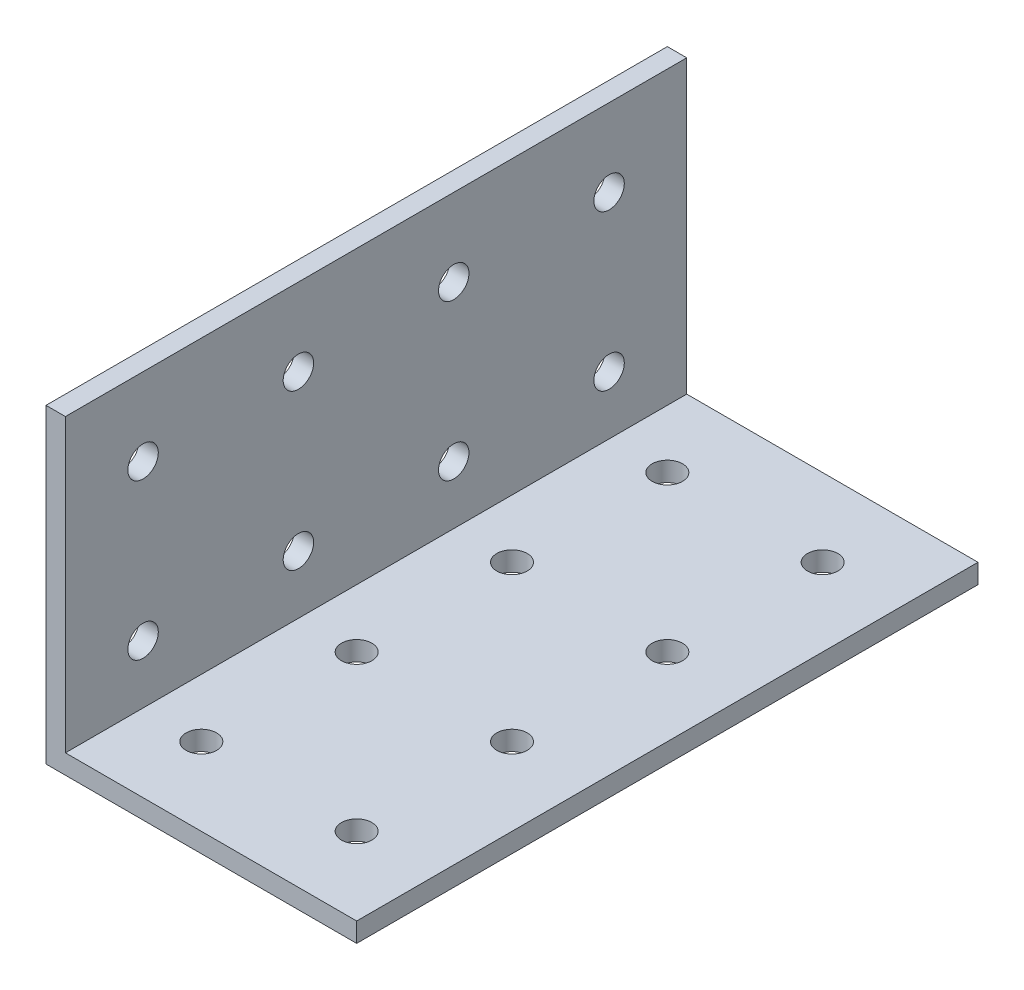
ISO-10303-21;
HEADER;
FILE_DESCRIPTION(('STEP AP214'),'2;1');
FILE_NAME('part.step','',(''),(''),'','','');
FILE_SCHEMA(('AUTOMOTIVE_DESIGN { 1 0 10303 214 1 1 1 1 }'));
ENDSEC;
DATA;
#1=APPLICATION_CONTEXT('core data for automotive mechanical design processes');
#2=APPLICATION_PROTOCOL_DEFINITION('international standard','automotive_design',2000,#1);
#3=PRODUCT_CONTEXT('',#1,'mechanical');
#4=PRODUCT('Part','Part','',(#3));
#5=PRODUCT_RELATED_PRODUCT_CATEGORY('part','',(#4));
#6=PRODUCT_DEFINITION_FORMATION('','',#4);
#7=PRODUCT_DEFINITION_CONTEXT('part definition',#1,'design');
#8=PRODUCT_DEFINITION('design','',#6,#7);
#9=PRODUCT_DEFINITION_SHAPE('','',#8);
#10=(LENGTH_UNIT() NAMED_UNIT(*) SI_UNIT(.MILLI.,.METRE.));
#11=(NAMED_UNIT(*) PLANE_ANGLE_UNIT() SI_UNIT($,.RADIAN.));
#12=(NAMED_UNIT(*) SI_UNIT($,.STERADIAN.) SOLID_ANGLE_UNIT());
#13=UNCERTAINTY_MEASURE_WITH_UNIT(LENGTH_MEASURE(1.E-05),#10,'distance_accuracy_value','');
#14=(GEOMETRIC_REPRESENTATION_CONTEXT(3) GLOBAL_UNCERTAINTY_ASSIGNED_CONTEXT((#13)) GLOBAL_UNIT_ASSIGNED_CONTEXT((#10,
#11,#12)) REPRESENTATION_CONTEXT('',''));
#15=CARTESIAN_POINT('',(0.,0.,0.));
#16=DIRECTION('',(0.,0.,1.));
#17=DIRECTION('',(1.,0.,0.));
#18=AXIS2_PLACEMENT_3D('',#15,#16,#17);
#19=CARTESIAN_POINT('',(0.,0.,101.6));
#20=DIRECTION('',(-1.,0.,0.));
#21=DIRECTION('',(0.,0.,1.));
#22=AXIS2_PLACEMENT_3D('',#19,#20,#21);
#23=PLANE('',#22);
#24=CARTESIAN_POINT('',(0.,12.7,63.5));
#25=DIRECTION('',(-1.,0.,0.));
#26=DIRECTION('',(0.,0.,1.));
#27=AXIS2_PLACEMENT_3D('',#24,#25,#26);
#28=CIRCLE('',#27,2.48920000000001);
#29=CARTESIAN_POINT('',(0.,12.7,65.9892));
#30=VERTEX_POINT('',#29);
#31=EDGE_CURVE('E193',#30,#30,#28,.T.);
#32=ORIENTED_EDGE('',*,*,#31,.F.);
#33=EDGE_LOOP('',(#32));
#34=FACE_BOUND('',#33,.T.);
#35=CARTESIAN_POINT('',(0.,38.1,12.7));
#36=DIRECTION('',(-1.,0.,0.));
#37=DIRECTION('',(0.,0.,1.));
#38=AXIS2_PLACEMENT_3D('',#35,#36,#37);
#39=CIRCLE('',#38,2.4892);
#40=CARTESIAN_POINT('',(0.,38.1,15.1892));
#41=VERTEX_POINT('',#40);
#42=EDGE_CURVE('E197',#41,#41,#39,.T.);
#43=ORIENTED_EDGE('',*,*,#42,.F.);
#44=EDGE_LOOP('',(#43));
#45=FACE_BOUND('',#44,.T.);
#46=CARTESIAN_POINT('',(0.,38.1,38.1));
#47=DIRECTION('',(-1.,0.,0.));
#48=DIRECTION('',(0.,0.,1.));
#49=AXIS2_PLACEMENT_3D('',#46,#47,#48);
#50=CIRCLE('',#49,2.4892);
#51=CARTESIAN_POINT('',(0.,38.1,40.5892));
#52=VERTEX_POINT('',#51);
#53=EDGE_CURVE('E201',#52,#52,#50,.T.);
#54=ORIENTED_EDGE('',*,*,#53,.F.);
#55=EDGE_LOOP('',(#54));
#56=FACE_BOUND('',#55,.T.);
#57=CARTESIAN_POINT('',(0.,38.1,63.5));
#58=DIRECTION('',(-1.,0.,0.));
#59=DIRECTION('',(0.,0.,1.));
#60=AXIS2_PLACEMENT_3D('',#57,#58,#59);
#61=CIRCLE('',#60,2.48920000000001);
#62=CARTESIAN_POINT('',(0.,38.1,65.9892));
#63=VERTEX_POINT('',#62);
#64=EDGE_CURVE('E205',#63,#63,#61,.T.);
#65=ORIENTED_EDGE('',*,*,#64,.F.);
#66=EDGE_LOOP('',(#65));
#67=FACE_BOUND('',#66,.T.);
#68=CARTESIAN_POINT('',(0.,12.7,38.1));
#69=DIRECTION('',(-1.,0.,0.));
#70=DIRECTION('',(0.,0.,1.));
#71=AXIS2_PLACEMENT_3D('',#68,#69,#70);
#72=CIRCLE('',#71,2.4892);
#73=CARTESIAN_POINT('',(0.,12.7,40.5892));
#74=VERTEX_POINT('',#73);
#75=EDGE_CURVE('E209',#74,#74,#72,.T.);
#76=ORIENTED_EDGE('',*,*,#75,.F.);
#77=EDGE_LOOP('',(#76));
#78=FACE_BOUND('',#77,.T.);
#79=CARTESIAN_POINT('',(0.,12.7,12.7));
#80=DIRECTION('',(-1.,0.,0.));
#81=DIRECTION('',(0.,0.,1.));
#82=AXIS2_PLACEMENT_3D('',#79,#80,#81);
#83=CIRCLE('',#82,2.4892);
#84=CARTESIAN_POINT('',(0.,12.7,15.1892));
#85=VERTEX_POINT('',#84);
#86=EDGE_CURVE('E213',#85,#85,#83,.T.);
#87=ORIENTED_EDGE('',*,*,#86,.F.);
#88=EDGE_LOOP('',(#87));
#89=FACE_BOUND('',#88,.T.);
#90=CARTESIAN_POINT('',(0.,12.7,88.9));
#91=DIRECTION('',(-1.,0.,0.));
#92=DIRECTION('',(0.,0.,1.));
#93=AXIS2_PLACEMENT_3D('',#90,#91,#92);
#94=CIRCLE('',#93,2.4892);
#95=CARTESIAN_POINT('',(0.,12.7,91.3892));
#96=VERTEX_POINT('',#95);
#97=EDGE_CURVE('E217',#96,#96,#94,.T.);
#98=ORIENTED_EDGE('',*,*,#97,.F.);
#99=EDGE_LOOP('',(#98));
#100=FACE_BOUND('',#99,.T.);
#101=CARTESIAN_POINT('',(0.,38.1,88.9));
#102=DIRECTION('',(-1.,0.,0.));
#103=DIRECTION('',(0.,0.,1.));
#104=AXIS2_PLACEMENT_3D('',#101,#102,#103);
#105=CIRCLE('',#104,2.4892);
#106=CARTESIAN_POINT('',(0.,38.1,91.3892));
#107=VERTEX_POINT('',#106);
#108=EDGE_CURVE('E220',#107,#107,#105,.T.);
#109=ORIENTED_EDGE('',*,*,#108,.F.);
#110=EDGE_LOOP('',(#109));
#111=FACE_BOUND('',#110,.T.);
#112=DIRECTION('',(0.,1.,0.));
#113=VECTOR('',#112,1.);
#114=CARTESIAN_POINT('',(0.,0.,0.));
#115=LINE('',#114,#113);
#116=CARTESIAN_POINT('',(0.,0.,0.));
#117=VERTEX_POINT('',#116);
#118=CARTESIAN_POINT('',(0.,50.8,0.));
#119=VERTEX_POINT('',#118);
#120=EDGE_CURVE('E134',#117,#119,#115,.T.);
#121=ORIENTED_EDGE('',*,*,#120,.F.);
#122=DIRECTION('',(0.,0.,-1.));
#123=VECTOR('',#122,1.);
#124=CARTESIAN_POINT('',(0.,0.,101.6));
#125=LINE('',#124,#123);
#126=CARTESIAN_POINT('',(0.,0.,101.6));
#127=VERTEX_POINT('',#126);
#128=EDGE_CURVE('E11',#127,#117,#125,.T.);
#129=ORIENTED_EDGE('',*,*,#128,.F.);
#130=DIRECTION('',(0.,1.,0.));
#131=VECTOR('',#130,1.);
#132=CARTESIAN_POINT('',(0.,0.,101.6));
#133=LINE('',#132,#131);
#134=CARTESIAN_POINT('',(0.,50.8,101.6));
#135=VERTEX_POINT('',#134);
#136=EDGE_CURVE('E154',#127,#135,#133,.T.);
#137=ORIENTED_EDGE('',*,*,#136,.T.);
#138=DIRECTION('',(0.,0.,-1.));
#139=VECTOR('',#138,1.);
#140=CARTESIAN_POINT('',(0.,50.8,101.6));
#141=LINE('',#140,#139);
#142=EDGE_CURVE('E62',#135,#119,#141,.T.);
#143=ORIENTED_EDGE('',*,*,#142,.T.);
#144=EDGE_LOOP('',(#121,#129,#137,#143));
#145=FACE_BOUND('',#144,.T.);
#146=ADVANCED_FACE('F45',(#34,#45,#56,#67,#78,#89,#100,#111,#145),#23,.T.);
#147=CARTESIAN_POINT('',(0.,0.,101.6));
#148=DIRECTION('',(0.,1.,0.));
#149=DIRECTION('',(0.,0.,1.));
#150=AXIS2_PLACEMENT_3D('',#147,#148,#149);
#151=PLANE('',#150);
#152=CARTESIAN_POINT('',(38.1,0.,88.9));
#153=DIRECTION('',(0.,1.,0.));
#154=DIRECTION('',(0.,0.,1.));
#155=AXIS2_PLACEMENT_3D('',#152,#153,#154);
#156=CIRCLE('',#155,2.4892);
#157=CARTESIAN_POINT('',(38.1,0.,91.3892));
#158=VERTEX_POINT('',#157);
#159=EDGE_CURVE('E138',#158,#158,#156,.T.);
#160=ORIENTED_EDGE('',*,*,#159,.T.);
#161=EDGE_LOOP('',(#160));
#162=FACE_BOUND('',#161,.T.);
#163=CARTESIAN_POINT('',(38.1,0.,63.5));
#164=DIRECTION('',(0.,1.,0.));
#165=DIRECTION('',(0.,0.,1.));
#166=AXIS2_PLACEMENT_3D('',#163,#164,#165);
#167=CIRCLE('',#166,2.4892);
#168=CARTESIAN_POINT('',(38.1,0.,65.9892));
#169=VERTEX_POINT('',#168);
#170=EDGE_CURVE('E301',#169,#169,#167,.T.);
#171=ORIENTED_EDGE('',*,*,#170,.T.);
#172=EDGE_LOOP('',(#171));
#173=FACE_BOUND('',#172,.T.);
#174=CARTESIAN_POINT('',(38.1,0.,38.1));
#175=DIRECTION('',(0.,1.,0.));
#176=DIRECTION('',(0.,0.,1.));
#177=AXIS2_PLACEMENT_3D('',#174,#175,#176);
#178=CIRCLE('',#177,2.4892);
#179=CARTESIAN_POINT('',(38.1,0.,40.5892));
#180=VERTEX_POINT('',#179);
#181=EDGE_CURVE('E297',#180,#180,#178,.T.);
#182=ORIENTED_EDGE('',*,*,#181,.T.);
#183=EDGE_LOOP('',(#182));
#184=FACE_BOUND('',#183,.T.);
#185=CARTESIAN_POINT('',(12.7,0.,88.9));
#186=DIRECTION('',(0.,1.,0.));
#187=DIRECTION('',(0.,0.,1.));
#188=AXIS2_PLACEMENT_3D('',#185,#186,#187);
#189=CIRCLE('',#188,2.4892);
#190=CARTESIAN_POINT('',(12.7,0.,91.3892));
#191=VERTEX_POINT('',#190);
#192=EDGE_CURVE('E293',#191,#191,#189,.T.);
#193=ORIENTED_EDGE('',*,*,#192,.T.);
#194=EDGE_LOOP('',(#193));
#195=FACE_BOUND('',#194,.T.);
#196=CARTESIAN_POINT('',(12.7,0.,63.5));
#197=DIRECTION('',(0.,1.,0.));
#198=DIRECTION('',(0.,0.,1.));
#199=AXIS2_PLACEMENT_3D('',#196,#197,#198);
#200=CIRCLE('',#199,2.4892);
#201=CARTESIAN_POINT('',(12.7,0.,65.9892));
#202=VERTEX_POINT('',#201);
#203=EDGE_CURVE('E289',#202,#202,#200,.T.);
#204=ORIENTED_EDGE('',*,*,#203,.T.);
#205=EDGE_LOOP('',(#204));
#206=FACE_BOUND('',#205,.T.);
#207=CARTESIAN_POINT('',(12.7,0.,38.1));
#208=DIRECTION('',(0.,1.,0.));
#209=DIRECTION('',(0.,0.,1.));
#210=AXIS2_PLACEMENT_3D('',#207,#208,#209);
#211=CIRCLE('',#210,2.4892);
#212=CARTESIAN_POINT('',(12.7,0.,40.5892));
#213=VERTEX_POINT('',#212);
#214=EDGE_CURVE('E285',#213,#213,#211,.T.);
#215=ORIENTED_EDGE('',*,*,#214,.T.);
#216=EDGE_LOOP('',(#215));
#217=FACE_BOUND('',#216,.T.);
#218=CARTESIAN_POINT('',(12.7,0.,12.7));
#219=DIRECTION('',(0.,1.,0.));
#220=DIRECTION('',(0.,0.,1.));
#221=AXIS2_PLACEMENT_3D('',#218,#219,#220);
#222=CIRCLE('',#221,2.4892);
#223=CARTESIAN_POINT('',(12.7,0.,15.1892));
#224=VERTEX_POINT('',#223);
#225=EDGE_CURVE('E281',#224,#224,#222,.T.);
#226=ORIENTED_EDGE('',*,*,#225,.T.);
#227=EDGE_LOOP('',(#226));
#228=FACE_BOUND('',#227,.T.);
#229=CARTESIAN_POINT('',(38.1,0.,12.7));
#230=DIRECTION('',(0.,1.,0.));
#231=DIRECTION('',(0.,0.,1.));
#232=AXIS2_PLACEMENT_3D('',#229,#230,#231);
#233=CIRCLE('',#232,2.4892);
#234=CARTESIAN_POINT('',(38.1,0.,15.1892));
#235=VERTEX_POINT('',#234);
#236=EDGE_CURVE('E277',#235,#235,#233,.T.);
#237=ORIENTED_EDGE('',*,*,#236,.T.);
#238=EDGE_LOOP('',(#237));
#239=FACE_BOUND('',#238,.T.);
#240=DIRECTION('',(1.,0.,0.));
#241=VECTOR('',#240,1.);
#242=CARTESIAN_POINT('',(0.,0.,0.));
#243=LINE('',#242,#241);
#244=CARTESIAN_POINT('',(50.8,0.,0.));
#245=VERTEX_POINT('',#244);
#246=EDGE_CURVE('E137',#117,#245,#243,.T.);
#247=ORIENTED_EDGE('',*,*,#246,.T.);
#248=DIRECTION('',(0.,0.,-1.));
#249=VECTOR('',#248,1.);
#250=CARTESIAN_POINT('',(50.8,0.,101.6));
#251=LINE('',#250,#249);
#252=CARTESIAN_POINT('',(50.8,0.,101.6));
#253=VERTEX_POINT('',#252);
#254=EDGE_CURVE('E54',#253,#245,#251,.T.);
#255=ORIENTED_EDGE('',*,*,#254,.F.);
#256=DIRECTION('',(1.,0.,0.));
#257=VECTOR('',#256,1.);
#258=CARTESIAN_POINT('',(0.,0.,101.6));
#259=LINE('',#258,#257);
#260=EDGE_CURVE('E128',#127,#253,#259,.T.);
#261=ORIENTED_EDGE('',*,*,#260,.F.);
#262=ORIENTED_EDGE('',*,*,#128,.T.);
#263=EDGE_LOOP('',(#247,#255,#261,#262));
#264=FACE_BOUND('',#263,.T.);
#265=ADVANCED_FACE('F183',(#162,#173,#184,#195,#206,#217,#228,#239,#264),#151,.F.);
#266=CARTESIAN_POINT('',(50.8,0.,101.6));
#267=DIRECTION('',(-1.,0.,0.));
#268=DIRECTION('',(0.,0.,1.));
#269=AXIS2_PLACEMENT_3D('',#266,#267,#268);
#270=PLANE('',#269);
#271=DIRECTION('',(0.,1.,0.));
#272=VECTOR('',#271,1.);
#273=CARTESIAN_POINT('',(50.8,0.,0.));
#274=LINE('',#273,#272);
#275=CARTESIAN_POINT('',(50.8,3.175,0.));
#276=VERTEX_POINT('',#275);
#277=EDGE_CURVE('E141',#245,#276,#274,.T.);
#278=ORIENTED_EDGE('',*,*,#277,.T.);
#279=DIRECTION('',(0.,0.,-1.));
#280=VECTOR('',#279,1.);
#281=CARTESIAN_POINT('',(50.8,3.175,101.6));
#282=LINE('',#281,#280);
#283=CARTESIAN_POINT('',(50.8,3.175,101.6));
#284=VERTEX_POINT('',#283);
#285=EDGE_CURVE('E111',#284,#276,#282,.T.);
#286=ORIENTED_EDGE('',*,*,#285,.F.);
#287=DIRECTION('',(0.,1.,0.));
#288=VECTOR('',#287,1.);
#289=CARTESIAN_POINT('',(50.8,0.,101.6));
#290=LINE('',#289,#288);
#291=EDGE_CURVE('E123',#253,#284,#290,.T.);
#292=ORIENTED_EDGE('',*,*,#291,.F.);
#293=ORIENTED_EDGE('',*,*,#254,.T.);
#294=EDGE_LOOP('',(#278,#286,#292,#293));
#295=FACE_BOUND('',#294,.T.);
#296=ADVANCED_FACE('F165',(#295),#270,.F.);
#297=CARTESIAN_POINT('',(0.,3.175,101.6));
#298=DIRECTION('',(0.,1.,0.));
#299=DIRECTION('',(0.,0.,1.));
#300=AXIS2_PLACEMENT_3D('',#297,#298,#299);
#301=PLANE('',#300);
#302=CARTESIAN_POINT('',(38.1,3.175,88.9));
#303=DIRECTION('',(0.,1.,0.));
#304=DIRECTION('',(0.,0.,1.));
#305=AXIS2_PLACEMENT_3D('',#302,#303,#304);
#306=CIRCLE('',#305,2.4892);
#307=CARTESIAN_POINT('',(38.1,3.175,91.3892));
#308=VERTEX_POINT('',#307);
#309=EDGE_CURVE('E245',#308,#308,#306,.T.);
#310=ORIENTED_EDGE('',*,*,#309,.F.);
#311=EDGE_LOOP('',(#310));
#312=FACE_BOUND('',#311,.T.);
#313=CARTESIAN_POINT('',(38.1,3.175,63.5));
#314=DIRECTION('',(0.,1.,0.));
#315=DIRECTION('',(0.,0.,1.));
#316=AXIS2_PLACEMENT_3D('',#313,#314,#315);
#317=CIRCLE('',#316,2.4892);
#318=CARTESIAN_POINT('',(38.1,3.175,65.9892));
#319=VERTEX_POINT('',#318);
#320=EDGE_CURVE('E267',#319,#319,#317,.T.);
#321=ORIENTED_EDGE('',*,*,#320,.F.);
#322=EDGE_LOOP('',(#321));
#323=FACE_BOUND('',#322,.T.);
#324=CARTESIAN_POINT('',(38.1,3.175,38.1));
#325=DIRECTION('',(0.,1.,0.));
#326=DIRECTION('',(0.,0.,1.));
#327=AXIS2_PLACEMENT_3D('',#324,#325,#326);
#328=CIRCLE('',#327,2.4892);
#329=CARTESIAN_POINT('',(38.1,3.175,40.5892));
#330=VERTEX_POINT('',#329);
#331=EDGE_CURVE('E263',#330,#330,#328,.T.);
#332=ORIENTED_EDGE('',*,*,#331,.F.);
#333=EDGE_LOOP('',(#332));
#334=FACE_BOUND('',#333,.T.);
#335=CARTESIAN_POINT('',(12.7,3.175,88.9));
#336=DIRECTION('',(0.,1.,0.));
#337=DIRECTION('',(0.,0.,1.));
#338=AXIS2_PLACEMENT_3D('',#335,#336,#337);
#339=CIRCLE('',#338,2.4892);
#340=CARTESIAN_POINT('',(12.7,3.175,91.3892));
#341=VERTEX_POINT('',#340);
#342=EDGE_CURVE('E259',#341,#341,#339,.T.);
#343=ORIENTED_EDGE('',*,*,#342,.F.);
#344=EDGE_LOOP('',(#343));
#345=FACE_BOUND('',#344,.T.);
#346=CARTESIAN_POINT('',(12.7,3.175,63.5));
#347=DIRECTION('',(0.,1.,0.));
#348=DIRECTION('',(0.,0.,1.));
#349=AXIS2_PLACEMENT_3D('',#346,#347,#348);
#350=CIRCLE('',#349,2.4892);
#351=CARTESIAN_POINT('',(12.7,3.175,65.9892));
#352=VERTEX_POINT('',#351);
#353=EDGE_CURVE('E255',#352,#352,#350,.T.);
#354=ORIENTED_EDGE('',*,*,#353,.F.);
#355=EDGE_LOOP('',(#354));
#356=FACE_BOUND('',#355,.T.);
#357=CARTESIAN_POINT('',(12.7,3.175,38.1));
#358=DIRECTION('',(0.,1.,0.));
#359=DIRECTION('',(0.,0.,1.));
#360=AXIS2_PLACEMENT_3D('',#357,#358,#359);
#361=CIRCLE('',#360,2.4892);
#362=CARTESIAN_POINT('',(12.7,3.175,40.5892));
#363=VERTEX_POINT('',#362);
#364=EDGE_CURVE('E251',#363,#363,#361,.T.);
#365=ORIENTED_EDGE('',*,*,#364,.F.);
#366=EDGE_LOOP('',(#365));
#367=FACE_BOUND('',#366,.T.);
#368=CARTESIAN_POINT('',(12.7,3.175,12.7));
#369=DIRECTION('',(0.,1.,0.));
#370=DIRECTION('',(0.,0.,1.));
#371=AXIS2_PLACEMENT_3D('',#368,#369,#370);
#372=CIRCLE('',#371,2.4892);
#373=CARTESIAN_POINT('',(12.7,3.175,15.1892));
#374=VERTEX_POINT('',#373);
#375=EDGE_CURVE('E246',#374,#374,#372,.T.);
#376=ORIENTED_EDGE('',*,*,#375,.F.);
#377=EDGE_LOOP('',(#376));
#378=FACE_BOUND('',#377,.T.);
#379=CARTESIAN_POINT('',(38.1,3.175,12.7));
#380=DIRECTION('',(0.,1.,0.));
#381=DIRECTION('',(0.,0.,1.));
#382=AXIS2_PLACEMENT_3D('',#379,#380,#381);
#383=CIRCLE('',#382,2.4892);
#384=CARTESIAN_POINT('',(38.1,3.175,15.1892));
#385=VERTEX_POINT('',#384);
#386=EDGE_CURVE('E250',#385,#385,#383,.T.);
#387=ORIENTED_EDGE('',*,*,#386,.F.);
#388=EDGE_LOOP('',(#387));
#389=FACE_BOUND('',#388,.T.);
#390=DIRECTION('',(1.,0.,0.));
#391=VECTOR('',#390,1.);
#392=CARTESIAN_POINT('',(0.,3.175,0.));
#393=LINE('',#392,#391);
#394=CARTESIAN_POINT('',(3.175,3.175,0.));
#395=VERTEX_POINT('',#394);
#396=EDGE_CURVE('E107',#395,#276,#393,.T.);
#397=ORIENTED_EDGE('',*,*,#396,.F.);
#398=DIRECTION('',(0.,0.,-1.));
#399=VECTOR('',#398,1.);
#400=CARTESIAN_POINT('',(3.175,3.175,101.6));
#401=LINE('',#400,#399);
#402=CARTESIAN_POINT('',(3.175,3.175,101.6));
#403=VERTEX_POINT('',#402);
#404=EDGE_CURVE('E101',#403,#395,#401,.T.);
#405=ORIENTED_EDGE('',*,*,#404,.F.);
#406=DIRECTION('',(1.,0.,0.));
#407=VECTOR('',#406,1.);
#408=CARTESIAN_POINT('',(0.,3.175,101.6));
#409=LINE('',#408,#407);
#410=EDGE_CURVE('E105',#403,#284,#409,.T.);
#411=ORIENTED_EDGE('',*,*,#410,.T.);
#412=ORIENTED_EDGE('',*,*,#285,.T.);
#413=EDGE_LOOP('',(#397,#405,#411,#412));
#414=FACE_BOUND('',#413,.T.);
#415=ADVANCED_FACE('F103',(#312,#323,#334,#345,#356,#367,#378,#389,#414),#301,.T.);
#416=CARTESIAN_POINT('',(3.175,0.,101.6));
#417=DIRECTION('',(-1.,0.,0.));
#418=DIRECTION('',(0.,0.,1.));
#419=AXIS2_PLACEMENT_3D('',#416,#417,#418);
#420=PLANE('',#419);
#421=CARTESIAN_POINT('',(3.175,12.7,63.5));
#422=DIRECTION('',(1.,0.,0.));
#423=DIRECTION('',(0.,0.,-1.));
#424=AXIS2_PLACEMENT_3D('',#421,#422,#423);
#425=CIRCLE('',#424,2.48920000000001);
#426=CARTESIAN_POINT('',(3.175,12.7,61.0108));
#427=VERTEX_POINT('',#426);
#428=EDGE_CURVE('E491',#427,#427,#425,.T.);
#429=ORIENTED_EDGE('',*,*,#428,.F.);
#430=EDGE_LOOP('',(#429));
#431=FACE_BOUND('',#430,.T.);
#432=CARTESIAN_POINT('',(3.175,38.1,12.7));
#433=DIRECTION('',(1.,0.,0.));
#434=DIRECTION('',(0.,0.,-1.));
#435=AXIS2_PLACEMENT_3D('',#432,#433,#434);
#436=CIRCLE('',#435,2.4892);
#437=CARTESIAN_POINT('',(3.175,38.1,10.2108));
#438=VERTEX_POINT('',#437);
#439=EDGE_CURVE('E493',#438,#438,#436,.T.);
#440=ORIENTED_EDGE('',*,*,#439,.F.);
#441=EDGE_LOOP('',(#440));
#442=FACE_BOUND('',#441,.T.);
#443=CARTESIAN_POINT('',(3.175,38.1,38.1));
#444=DIRECTION('',(1.,0.,0.));
#445=DIRECTION('',(0.,0.,-1.));
#446=AXIS2_PLACEMENT_3D('',#443,#444,#445);
#447=CIRCLE('',#446,2.4892);
#448=CARTESIAN_POINT('',(3.175,38.1,35.6108));
#449=VERTEX_POINT('',#448);
#450=EDGE_CURVE('E499',#449,#449,#447,.T.);
#451=ORIENTED_EDGE('',*,*,#450,.F.);
#452=EDGE_LOOP('',(#451));
#453=FACE_BOUND('',#452,.T.);
#454=CARTESIAN_POINT('',(3.175,38.1,63.5));
#455=DIRECTION('',(1.,0.,0.));
#456=DIRECTION('',(0.,0.,-1.));
#457=AXIS2_PLACEMENT_3D('',#454,#455,#456);
#458=CIRCLE('',#457,2.48920000000001);
#459=CARTESIAN_POINT('',(3.175,38.1,61.0108));
#460=VERTEX_POINT('',#459);
#461=EDGE_CURVE('E229',#460,#460,#458,.T.);
#462=ORIENTED_EDGE('',*,*,#461,.F.);
#463=EDGE_LOOP('',(#462));
#464=FACE_BOUND('',#463,.T.);
#465=CARTESIAN_POINT('',(3.175,12.7,38.1));
#466=DIRECTION('',(1.,0.,0.));
#467=DIRECTION('',(0.,0.,-1.));
#468=AXIS2_PLACEMENT_3D('',#465,#466,#467);
#469=CIRCLE('',#468,2.4892);
#470=CARTESIAN_POINT('',(3.175,12.7,35.6108));
#471=VERTEX_POINT('',#470);
#472=EDGE_CURVE('E494',#471,#471,#469,.T.);
#473=ORIENTED_EDGE('',*,*,#472,.F.);
#474=EDGE_LOOP('',(#473));
#475=FACE_BOUND('',#474,.T.);
#476=CARTESIAN_POINT('',(3.175,12.7,12.7));
#477=DIRECTION('',(1.,0.,0.));
#478=DIRECTION('',(0.,0.,-1.));
#479=AXIS2_PLACEMENT_3D('',#476,#477,#478);
#480=CIRCLE('',#479,2.4892);
#481=CARTESIAN_POINT('',(3.175,12.7,10.2108));
#482=VERTEX_POINT('',#481);
#483=EDGE_CURVE('E502',#482,#482,#480,.T.);
#484=ORIENTED_EDGE('',*,*,#483,.F.);
#485=EDGE_LOOP('',(#484));
#486=FACE_BOUND('',#485,.T.);
#487=CARTESIAN_POINT('',(3.175,12.7,88.9));
#488=DIRECTION('',(1.,0.,0.));
#489=DIRECTION('',(0.,0.,-1.));
#490=AXIS2_PLACEMENT_3D('',#487,#488,#489);
#491=CIRCLE('',#490,2.4892);
#492=CARTESIAN_POINT('',(3.175,12.7,86.4108));
#493=VERTEX_POINT('',#492);
#494=EDGE_CURVE('E524',#493,#493,#491,.T.);
#495=ORIENTED_EDGE('',*,*,#494,.F.);
#496=EDGE_LOOP('',(#495));
#497=FACE_BOUND('',#496,.T.);
#498=CARTESIAN_POINT('',(3.175,38.1,88.9));
#499=DIRECTION('',(1.,0.,0.));
#500=DIRECTION('',(0.,0.,-1.));
#501=AXIS2_PLACEMENT_3D('',#498,#499,#500);
#502=CIRCLE('',#501,2.4892);
#503=CARTESIAN_POINT('',(3.175,38.1,86.4108));
#504=VERTEX_POINT('',#503);
#505=EDGE_CURVE('E223',#504,#504,#502,.T.);
#506=ORIENTED_EDGE('',*,*,#505,.F.);
#507=EDGE_LOOP('',(#506));
#508=FACE_BOUND('',#507,.T.);
#509=DIRECTION('',(0.,1.,0.));
#510=VECTOR('',#509,1.);
#511=CARTESIAN_POINT('',(3.175,0.,0.));
#512=LINE('',#511,#510);
#513=CARTESIAN_POINT('',(3.175,50.8,0.));
#514=VERTEX_POINT('',#513);
#515=EDGE_CURVE('E147',#395,#514,#512,.T.);
#516=ORIENTED_EDGE('',*,*,#515,.T.);
#517=DIRECTION('',(0.,0.,-1.));
#518=VECTOR('',#517,1.);
#519=CARTESIAN_POINT('',(3.175,50.8,101.6));
#520=LINE('',#519,#518);
#521=CARTESIAN_POINT('',(3.175,50.8,101.6));
#522=VERTEX_POINT('',#521);
#523=EDGE_CURVE('E82',#522,#514,#520,.T.);
#524=ORIENTED_EDGE('',*,*,#523,.F.);
#525=DIRECTION('',(0.,1.,0.));
#526=VECTOR('',#525,1.);
#527=CARTESIAN_POINT('',(3.175,0.,101.6));
#528=LINE('',#527,#526);
#529=EDGE_CURVE('E113',#403,#522,#528,.T.);
#530=ORIENTED_EDGE('',*,*,#529,.F.);
#531=ORIENTED_EDGE('',*,*,#404,.T.);
#532=EDGE_LOOP('',(#516,#524,#530,#531));
#533=FACE_BOUND('',#532,.T.);
#534=ADVANCED_FACE('F114',(#431,#442,#453,#464,#475,#486,#497,#508,#533),#420,.F.);
#535=CARTESIAN_POINT('',(0.,50.8,101.6));
#536=DIRECTION('',(0.,1.,0.));
#537=DIRECTION('',(0.,0.,1.));
#538=AXIS2_PLACEMENT_3D('',#535,#536,#537);
#539=PLANE('',#538);
#540=DIRECTION('',(1.,0.,0.));
#541=VECTOR('',#540,1.);
#542=CARTESIAN_POINT('',(0.,50.8,0.));
#543=LINE('',#542,#541);
#544=EDGE_CURVE('E150',#119,#514,#543,.T.);
#545=ORIENTED_EDGE('',*,*,#544,.F.);
#546=ORIENTED_EDGE('',*,*,#142,.F.);
#547=DIRECTION('',(1.,0.,0.));
#548=VECTOR('',#547,1.);
#549=CARTESIAN_POINT('',(0.,50.8,101.6));
#550=LINE('',#549,#548);
#551=EDGE_CURVE('E118',#135,#522,#550,.T.);
#552=ORIENTED_EDGE('',*,*,#551,.T.);
#553=ORIENTED_EDGE('',*,*,#523,.T.);
#554=EDGE_LOOP('',(#545,#546,#552,#553));
#555=FACE_BOUND('',#554,.T.);
#556=ADVANCED_FACE('F170',(#555),#539,.T.);
#557=CARTESIAN_POINT('',(0.,0.,101.6));
#558=DIRECTION('',(0.,0.,1.));
#559=DIRECTION('',(1.,0.,0.));
#560=AXIS2_PLACEMENT_3D('',#557,#558,#559);
#561=PLANE('',#560);
#562=ORIENTED_EDGE('',*,*,#136,.F.);
#563=ORIENTED_EDGE('',*,*,#260,.T.);
#564=ORIENTED_EDGE('',*,*,#291,.T.);
#565=ORIENTED_EDGE('',*,*,#410,.F.);
#566=ORIENTED_EDGE('',*,*,#529,.T.);
#567=ORIENTED_EDGE('',*,*,#551,.F.);
#568=EDGE_LOOP('',(#562,#563,#564,#565,#566,#567));
#569=FACE_BOUND('',#568,.T.);
#570=ADVANCED_FACE('F121',(#569),#561,.T.);
#571=CARTESIAN_POINT('',(0.,0.,0.));
#572=DIRECTION('',(0.,0.,1.));
#573=DIRECTION('',(1.,0.,0.));
#574=AXIS2_PLACEMENT_3D('',#571,#572,#573);
#575=PLANE('',#574);
#576=ORIENTED_EDGE('',*,*,#120,.T.);
#577=ORIENTED_EDGE('',*,*,#544,.T.);
#578=ORIENTED_EDGE('',*,*,#515,.F.);
#579=ORIENTED_EDGE('',*,*,#396,.T.);
#580=ORIENTED_EDGE('',*,*,#277,.F.);
#581=ORIENTED_EDGE('',*,*,#246,.F.);
#582=EDGE_LOOP('',(#576,#577,#578,#579,#580,#581));
#583=FACE_BOUND('',#582,.T.);
#584=ADVANCED_FACE('F169',(#583),#575,.F.);
#585=CARTESIAN_POINT('',(38.1,-98.425,12.7));
#586=DIRECTION('',(0.,1.,0.));
#587=DIRECTION('',(0.,0.,1.));
#588=AXIS2_PLACEMENT_3D('',#585,#586,#587);
#589=CYLINDRICAL_SURFACE('',#588,2.4892);
#590=ORIENTED_EDGE('',*,*,#386,.T.);
#591=EDGE_LOOP('',(#590));
#592=FACE_BOUND('',#591,.T.);
#593=ORIENTED_EDGE('',*,*,#236,.F.);
#594=EDGE_LOOP('',(#593));
#595=FACE_BOUND('',#594,.T.);
#596=ADVANCED_FACE('F329',(#592,#595),#589,.F.);
#597=CARTESIAN_POINT('',(12.7,-98.425,12.7));
#598=DIRECTION('',(0.,1.,0.));
#599=DIRECTION('',(0.,0.,1.));
#600=AXIS2_PLACEMENT_3D('',#597,#598,#599);
#601=CYLINDRICAL_SURFACE('',#600,2.4892);
#602=ORIENTED_EDGE('',*,*,#375,.T.);
#603=EDGE_LOOP('',(#602));
#604=FACE_BOUND('',#603,.T.);
#605=ORIENTED_EDGE('',*,*,#225,.F.);
#606=EDGE_LOOP('',(#605));
#607=FACE_BOUND('',#606,.T.);
#608=ADVANCED_FACE('F331',(#604,#607),#601,.F.);
#609=CARTESIAN_POINT('',(12.7,-98.425,38.1));
#610=DIRECTION('',(0.,1.,0.));
#611=DIRECTION('',(0.,0.,1.));
#612=AXIS2_PLACEMENT_3D('',#609,#610,#611);
#613=CYLINDRICAL_SURFACE('',#612,2.4892);
#614=ORIENTED_EDGE('',*,*,#364,.T.);
#615=EDGE_LOOP('',(#614));
#616=FACE_BOUND('',#615,.T.);
#617=ORIENTED_EDGE('',*,*,#214,.F.);
#618=EDGE_LOOP('',(#617));
#619=FACE_BOUND('',#618,.T.);
#620=ADVANCED_FACE('F365',(#616,#619),#613,.F.);
#621=CARTESIAN_POINT('',(12.7,-98.425,63.5));
#622=DIRECTION('',(0.,1.,0.));
#623=DIRECTION('',(0.,0.,1.));
#624=AXIS2_PLACEMENT_3D('',#621,#622,#623);
#625=CYLINDRICAL_SURFACE('',#624,2.4892);
#626=ORIENTED_EDGE('',*,*,#353,.T.);
#627=EDGE_LOOP('',(#626));
#628=FACE_BOUND('',#627,.T.);
#629=ORIENTED_EDGE('',*,*,#203,.F.);
#630=EDGE_LOOP('',(#629));
#631=FACE_BOUND('',#630,.T.);
#632=ADVANCED_FACE('F374',(#628,#631),#625,.F.);
#633=CARTESIAN_POINT('',(12.7,-98.425,88.9));
#634=DIRECTION('',(0.,1.,0.));
#635=DIRECTION('',(0.,0.,1.));
#636=AXIS2_PLACEMENT_3D('',#633,#634,#635);
#637=CYLINDRICAL_SURFACE('',#636,2.4892);
#638=ORIENTED_EDGE('',*,*,#342,.T.);
#639=EDGE_LOOP('',(#638));
#640=FACE_BOUND('',#639,.T.);
#641=ORIENTED_EDGE('',*,*,#192,.F.);
#642=EDGE_LOOP('',(#641));
#643=FACE_BOUND('',#642,.T.);
#644=ADVANCED_FACE('F383',(#640,#643),#637,.F.);
#645=CARTESIAN_POINT('',(38.1,-98.425,38.1));
#646=DIRECTION('',(0.,1.,0.));
#647=DIRECTION('',(0.,0.,1.));
#648=AXIS2_PLACEMENT_3D('',#645,#646,#647);
#649=CYLINDRICAL_SURFACE('',#648,2.4892);
#650=ORIENTED_EDGE('',*,*,#331,.T.);
#651=EDGE_LOOP('',(#650));
#652=FACE_BOUND('',#651,.T.);
#653=ORIENTED_EDGE('',*,*,#181,.F.);
#654=EDGE_LOOP('',(#653));
#655=FACE_BOUND('',#654,.T.);
#656=ADVANCED_FACE('F324',(#652,#655),#649,.F.);
#657=CARTESIAN_POINT('',(38.1,-98.425,63.5));
#658=DIRECTION('',(0.,1.,0.));
#659=DIRECTION('',(0.,0.,1.));
#660=AXIS2_PLACEMENT_3D('',#657,#658,#659);
#661=CYLINDRICAL_SURFACE('',#660,2.4892);
#662=ORIENTED_EDGE('',*,*,#320,.T.);
#663=EDGE_LOOP('',(#662));
#664=FACE_BOUND('',#663,.T.);
#665=ORIENTED_EDGE('',*,*,#170,.F.);
#666=EDGE_LOOP('',(#665));
#667=FACE_BOUND('',#666,.T.);
#668=ADVANCED_FACE('F315',(#664,#667),#661,.F.);
#669=CARTESIAN_POINT('',(38.1,-98.425,88.9));
#670=DIRECTION('',(0.,1.,0.));
#671=DIRECTION('',(0.,0.,1.));
#672=AXIS2_PLACEMENT_3D('',#669,#670,#671);
#673=CYLINDRICAL_SURFACE('',#672,2.4892);
#674=ORIENTED_EDGE('',*,*,#309,.T.);
#675=EDGE_LOOP('',(#674));
#676=FACE_BOUND('',#675,.T.);
#677=ORIENTED_EDGE('',*,*,#159,.F.);
#678=EDGE_LOOP('',(#677));
#679=FACE_BOUND('',#678,.T.);
#680=ADVANCED_FACE('F313',(#676,#679),#673,.F.);
#681=CARTESIAN_POINT('',(-98.425,38.1,88.9));
#682=DIRECTION('',(1.,0.,0.));
#683=DIRECTION('',(0.,0.,-1.));
#684=AXIS2_PLACEMENT_3D('',#681,#682,#683);
#685=CYLINDRICAL_SURFACE('',#684,2.4892);
#686=ORIENTED_EDGE('',*,*,#108,.T.);
#687=EDGE_LOOP('',(#686));
#688=FACE_BOUND('',#687,.T.);
#689=ORIENTED_EDGE('',*,*,#505,.T.);
#690=EDGE_LOOP('',(#689));
#691=FACE_BOUND('',#690,.T.);
#692=ADVANCED_FACE('F314',(#688,#691),#685,.F.);
#693=CARTESIAN_POINT('',(-98.425,12.7,88.9));
#694=DIRECTION('',(1.,0.,0.));
#695=DIRECTION('',(0.,0.,-1.));
#696=AXIS2_PLACEMENT_3D('',#693,#694,#695);
#697=CYLINDRICAL_SURFACE('',#696,2.4892);
#698=ORIENTED_EDGE('',*,*,#97,.T.);
#699=EDGE_LOOP('',(#698));
#700=FACE_BOUND('',#699,.T.);
#701=ORIENTED_EDGE('',*,*,#494,.T.);
#702=EDGE_LOOP('',(#701));
#703=FACE_BOUND('',#702,.T.);
#704=ADVANCED_FACE('F322',(#700,#703),#697,.F.);
#705=CARTESIAN_POINT('',(-98.425,12.7,12.7));
#706=DIRECTION('',(1.,0.,0.));
#707=DIRECTION('',(0.,0.,-1.));
#708=AXIS2_PLACEMENT_3D('',#705,#706,#707);
#709=CYLINDRICAL_SURFACE('',#708,2.4892);
#710=ORIENTED_EDGE('',*,*,#86,.T.);
#711=EDGE_LOOP('',(#710));
#712=FACE_BOUND('',#711,.T.);
#713=ORIENTED_EDGE('',*,*,#483,.T.);
#714=EDGE_LOOP('',(#713));
#715=FACE_BOUND('',#714,.T.);
#716=ADVANCED_FACE('F425',(#712,#715),#709,.F.);
#717=CARTESIAN_POINT('',(-98.425,12.7,38.1));
#718=DIRECTION('',(1.,0.,0.));
#719=DIRECTION('',(0.,0.,-1.));
#720=AXIS2_PLACEMENT_3D('',#717,#718,#719);
#721=CYLINDRICAL_SURFACE('',#720,2.4892);
#722=ORIENTED_EDGE('',*,*,#75,.T.);
#723=EDGE_LOOP('',(#722));
#724=FACE_BOUND('',#723,.T.);
#725=ORIENTED_EDGE('',*,*,#472,.T.);
#726=EDGE_LOOP('',(#725));
#727=FACE_BOUND('',#726,.T.);
#728=ADVANCED_FACE('F435',(#724,#727),#721,.F.);
#729=CARTESIAN_POINT('',(-98.425,38.1,63.5));
#730=DIRECTION('',(1.,0.,0.));
#731=DIRECTION('',(0.,0.,-1.));
#732=AXIS2_PLACEMENT_3D('',#729,#730,#731);
#733=CYLINDRICAL_SURFACE('',#732,2.48920000000001);
#734=ORIENTED_EDGE('',*,*,#64,.T.);
#735=EDGE_LOOP('',(#734));
#736=FACE_BOUND('',#735,.T.);
#737=ORIENTED_EDGE('',*,*,#461,.T.);
#738=EDGE_LOOP('',(#737));
#739=FACE_BOUND('',#738,.T.);
#740=ADVANCED_FACE('F445',(#736,#739),#733,.F.);
#741=CARTESIAN_POINT('',(-98.425,38.1,38.1));
#742=DIRECTION('',(1.,0.,0.));
#743=DIRECTION('',(0.,0.,-1.));
#744=AXIS2_PLACEMENT_3D('',#741,#742,#743);
#745=CYLINDRICAL_SURFACE('',#744,2.4892);
#746=ORIENTED_EDGE('',*,*,#53,.T.);
#747=EDGE_LOOP('',(#746));
#748=FACE_BOUND('',#747,.T.);
#749=ORIENTED_EDGE('',*,*,#450,.T.);
#750=EDGE_LOOP('',(#749));
#751=FACE_BOUND('',#750,.T.);
#752=ADVANCED_FACE('F455',(#748,#751),#745,.F.);
#753=CARTESIAN_POINT('',(-98.425,38.1,12.7));
#754=DIRECTION('',(1.,0.,0.));
#755=DIRECTION('',(0.,0.,-1.));
#756=AXIS2_PLACEMENT_3D('',#753,#754,#755);
#757=CYLINDRICAL_SURFACE('',#756,2.4892);
#758=ORIENTED_EDGE('',*,*,#42,.T.);
#759=EDGE_LOOP('',(#758));
#760=FACE_BOUND('',#759,.T.);
#761=ORIENTED_EDGE('',*,*,#439,.T.);
#762=EDGE_LOOP('',(#761));
#763=FACE_BOUND('',#762,.T.);
#764=ADVANCED_FACE('F465',(#760,#763),#757,.F.);
#765=CARTESIAN_POINT('',(-98.425,12.7,63.5));
#766=DIRECTION('',(1.,0.,0.));
#767=DIRECTION('',(0.,0.,-1.));
#768=AXIS2_PLACEMENT_3D('',#765,#766,#767);
#769=CYLINDRICAL_SURFACE('',#768,2.48920000000001);
#770=ORIENTED_EDGE('',*,*,#31,.T.);
#771=EDGE_LOOP('',(#770));
#772=FACE_BOUND('',#771,.T.);
#773=ORIENTED_EDGE('',*,*,#428,.T.);
#774=EDGE_LOOP('',(#773));
#775=FACE_BOUND('',#774,.T.);
#776=ADVANCED_FACE('F475',(#772,#775),#769,.F.);
#777=CLOSED_SHELL('',(#146,#265,#296,#415,#534,#556,#570,#584,#596,#608,#620,#632,#644,#656,
#668,#680,#692,#704,#716,#728,#740,#752,#764,#776));
#778=MANIFOLD_SOLID_BREP('B2',#777);
#779=ADVANCED_BREP_SHAPE_REPRESENTATION('',(#18,#778),#14);
#780=SHAPE_DEFINITION_REPRESENTATION(#9,#779);
ENDSEC;
END-ISO-10303-21;
